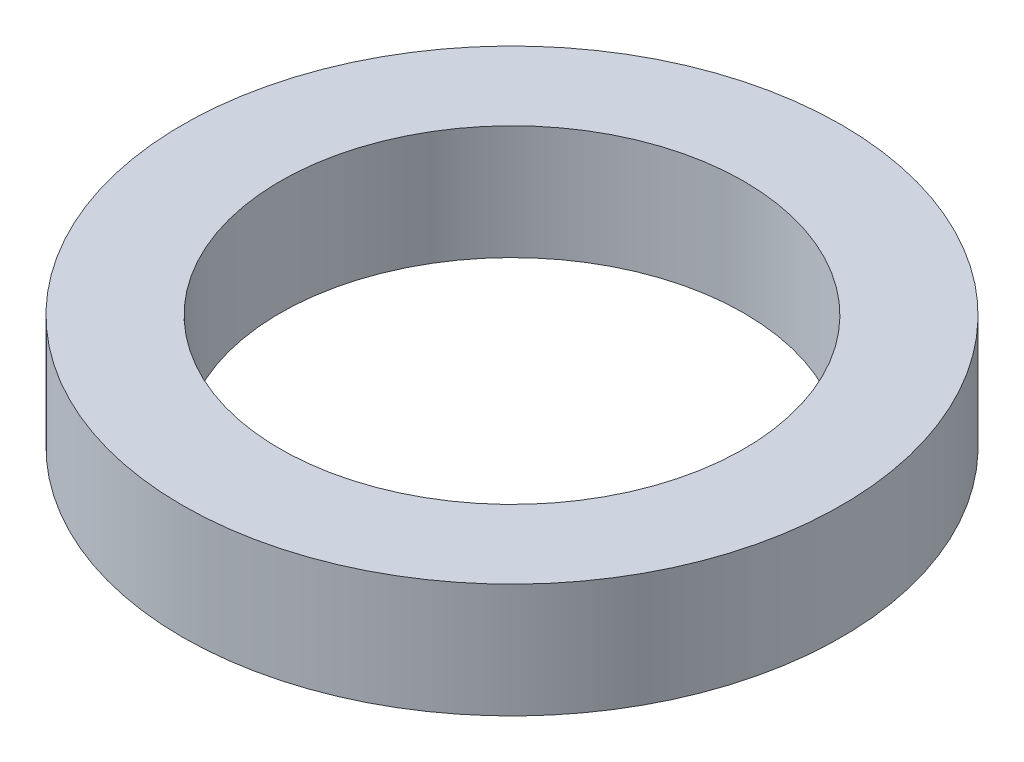
ISO-10303-21;
HEADER;
FILE_DESCRIPTION(('STEP AP214'),'2;1');
FILE_NAME('part.step','',(''),(''),'','','');
FILE_SCHEMA(('AUTOMOTIVE_DESIGN { 1 0 10303 214 1 1 1 1 }'));
ENDSEC;
DATA;
#1=APPLICATION_CONTEXT('core data for automotive mechanical design processes');
#2=APPLICATION_PROTOCOL_DEFINITION('international standard','automotive_design',2000,#1);
#3=PRODUCT_CONTEXT('',#1,'mechanical');
#4=PRODUCT('Part','Part','',(#3));
#5=PRODUCT_RELATED_PRODUCT_CATEGORY('part','',(#4));
#6=PRODUCT_DEFINITION_FORMATION('','',#4);
#7=PRODUCT_DEFINITION_CONTEXT('part definition',#1,'design');
#8=PRODUCT_DEFINITION('design','',#6,#7);
#9=PRODUCT_DEFINITION_SHAPE('','',#8);
#10=(LENGTH_UNIT() NAMED_UNIT(*) SI_UNIT(.MILLI.,.METRE.));
#11=(NAMED_UNIT(*) PLANE_ANGLE_UNIT() SI_UNIT($,.RADIAN.));
#12=(NAMED_UNIT(*) SI_UNIT($,.STERADIAN.) SOLID_ANGLE_UNIT());
#13=UNCERTAINTY_MEASURE_WITH_UNIT(LENGTH_MEASURE(1.E-05),#10,'distance_accuracy_value','');
#14=(GEOMETRIC_REPRESENTATION_CONTEXT(3) GLOBAL_UNCERTAINTY_ASSIGNED_CONTEXT((#13)) GLOBAL_UNIT_ASSIGNED_CONTEXT((#10,
#11,#12)) REPRESENTATION_CONTEXT('',''));
#15=CARTESIAN_POINT('',(0.,0.,0.));
#16=DIRECTION('',(0.,0.,1.));
#17=DIRECTION('',(1.,0.,0.));
#18=AXIS2_PLACEMENT_3D('',#15,#16,#17);
#19=CARTESIAN_POINT('',(4.619,2.5,0.));
#20=DIRECTION('',(0.,-1.,0.));
#21=DIRECTION('',(0.,0.,-1.));
#22=AXIS2_PLACEMENT_3D('',#19,#20,#21);
#23=PLANE('',#22);
#24=CARTESIAN_POINT('',(0.,2.5,0.));
#25=DIRECTION('',(0.,-1.,0.));
#26=DIRECTION('',(0.,0.,-1.));
#27=AXIS2_PLACEMENT_3D('',#24,#25,#26);
#28=CIRCLE('',#27,4.619);
#29=CARTESIAN_POINT('',(0.,2.5,-4.619));
#30=VERTEX_POINT('',#29);
#31=EDGE_CURVE('E49',#30,#30,#28,.T.);
#32=ORIENTED_EDGE('',*,*,#31,.T.);
#33=EDGE_LOOP('',(#32));
#34=FACE_BOUND('',#33,.T.);
#35=CARTESIAN_POINT('',(0.,2.5,0.));
#36=DIRECTION('',(0.,-1.,0.));
#37=DIRECTION('',(0.,0.,-1.));
#38=AXIS2_PLACEMENT_3D('',#35,#36,#37);
#39=CIRCLE('',#38,3.25);
#40=CARTESIAN_POINT('',(0.,2.5,-3.25));
#41=VERTEX_POINT('',#40);
#42=EDGE_CURVE('E10',#41,#41,#39,.T.);
#43=ORIENTED_EDGE('',*,*,#42,.F.);
#44=EDGE_LOOP('',(#43));
#45=FACE_BOUND('',#44,.T.);
#46=ADVANCED_FACE('F35',(#34,#45),#23,.T.);
#47=CARTESIAN_POINT('',(0.,-200.,0.));
#48=DIRECTION('',(0.,-1.,0.));
#49=DIRECTION('',(0.,0.,-1.));
#50=AXIS2_PLACEMENT_3D('',#47,#48,#49);
#51=CYLINDRICAL_SURFACE('',#50,3.25);
#52=ORIENTED_EDGE('',*,*,#42,.T.);
#53=EDGE_LOOP('',(#52));
#54=FACE_BOUND('',#53,.T.);
#55=CARTESIAN_POINT('',(0.,4.09999999999999,0.));
#56=DIRECTION('',(0.,-1.,0.));
#57=DIRECTION('',(0.,0.,-1.));
#58=AXIS2_PLACEMENT_3D('',#55,#56,#57);
#59=CIRCLE('',#58,3.25);
#60=CARTESIAN_POINT('',(0.,4.09999999999999,-3.25));
#61=VERTEX_POINT('',#60);
#62=EDGE_CURVE('E41',#61,#61,#59,.T.);
#63=ORIENTED_EDGE('',*,*,#62,.F.);
#64=EDGE_LOOP('',(#63));
#65=FACE_BOUND('',#64,.T.);
#66=ADVANCED_FACE('F65',(#54,#65),#51,.F.);
#67=CARTESIAN_POINT('',(3.25,4.1,0.));
#68=DIRECTION('',(0.,1.,0.));
#69=DIRECTION('',(0.,0.,1.));
#70=AXIS2_PLACEMENT_3D('',#67,#68,#69);
#71=PLANE('',#70);
#72=ORIENTED_EDGE('',*,*,#62,.T.);
#73=EDGE_LOOP('',(#72));
#74=FACE_BOUND('',#73,.T.);
#75=CARTESIAN_POINT('',(0.,4.09999999999999,0.));
#76=DIRECTION('',(0.,-1.,0.));
#77=DIRECTION('',(0.,0.,-1.));
#78=AXIS2_PLACEMENT_3D('',#75,#76,#77);
#79=CIRCLE('',#78,4.619);
#80=CARTESIAN_POINT('',(0.,4.09999999999999,-4.619));
#81=VERTEX_POINT('',#80);
#82=EDGE_CURVE('E45',#81,#81,#79,.T.);
#83=ORIENTED_EDGE('',*,*,#82,.F.);
#84=EDGE_LOOP('',(#83));
#85=FACE_BOUND('',#84,.T.);
#86=ADVANCED_FACE('F59',(#74,#85),#71,.T.);
#87=CARTESIAN_POINT('',(0.,-200.,0.));
#88=DIRECTION('',(0.,-1.,0.));
#89=DIRECTION('',(0.,0.,-1.));
#90=AXIS2_PLACEMENT_3D('',#87,#88,#89);
#91=CYLINDRICAL_SURFACE('',#90,4.619);
#92=ORIENTED_EDGE('',*,*,#82,.T.);
#93=EDGE_LOOP('',(#92));
#94=FACE_BOUND('',#93,.T.);
#95=ORIENTED_EDGE('',*,*,#31,.F.);
#96=EDGE_LOOP('',(#95));
#97=FACE_BOUND('',#96,.T.);
#98=ADVANCED_FACE('F57',(#94,#97),#91,.T.);
#99=CLOSED_SHELL('',(#46,#66,#86,#98));
#100=MANIFOLD_SOLID_BREP('B2',#99);
#101=ADVANCED_BREP_SHAPE_REPRESENTATION('',(#18,#100),#14);
#102=SHAPE_DEFINITION_REPRESENTATION(#9,#101);
ENDSEC;
END-ISO-10303-21;
